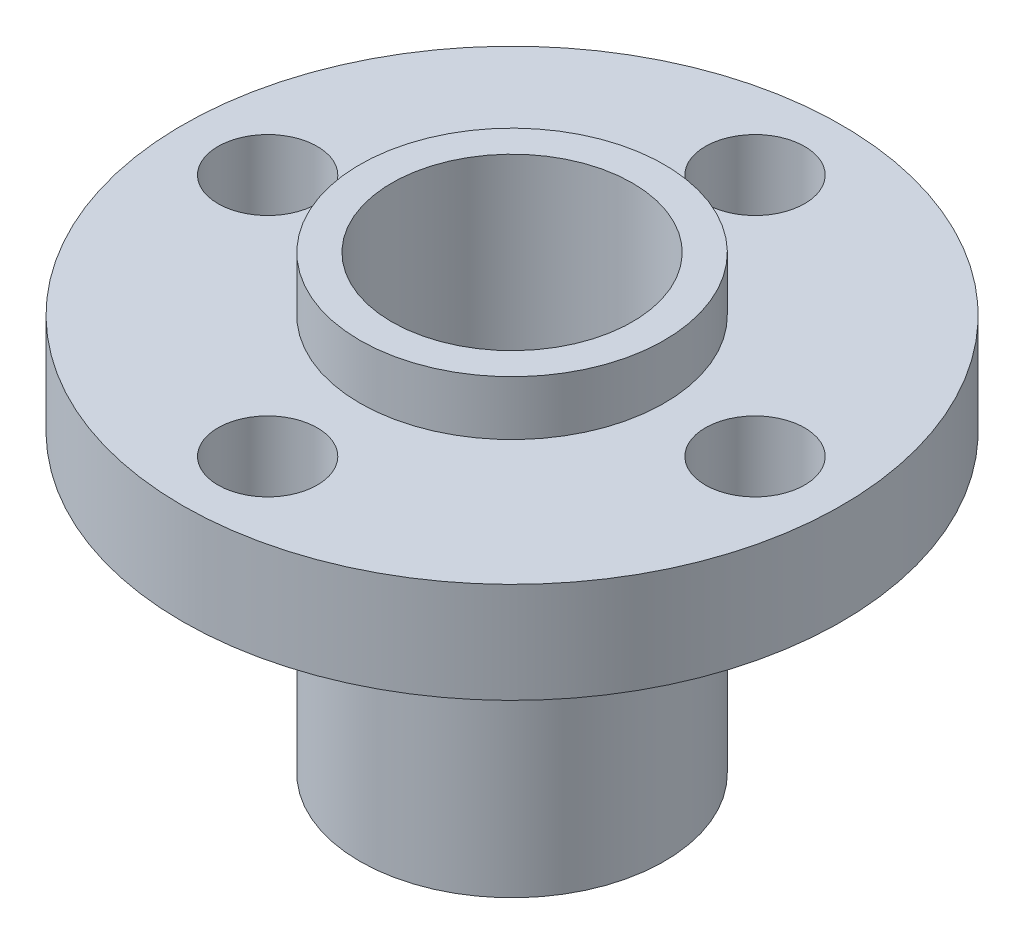
ISO-10303-21;
HEADER;
FILE_DESCRIPTION(('STEP AP214'),'2;1');
FILE_NAME('part.step','',(''),(''),'','','');
FILE_SCHEMA(('AUTOMOTIVE_DESIGN { 1 0 10303 214 1 1 1 1 }'));
ENDSEC;
DATA;
#1=APPLICATION_CONTEXT('core data for automotive mechanical design processes');
#2=APPLICATION_PROTOCOL_DEFINITION('international standard','automotive_design',2000,#1);
#3=PRODUCT_CONTEXT('',#1,'mechanical');
#4=PRODUCT('Part','Part','',(#3));
#5=PRODUCT_RELATED_PRODUCT_CATEGORY('part','',(#4));
#6=PRODUCT_DEFINITION_FORMATION('','',#4);
#7=PRODUCT_DEFINITION_CONTEXT('part definition',#1,'design');
#8=PRODUCT_DEFINITION('design','',#6,#7);
#9=PRODUCT_DEFINITION_SHAPE('','',#8);
#10=(LENGTH_UNIT() NAMED_UNIT(*) SI_UNIT(.MILLI.,.METRE.));
#11=(NAMED_UNIT(*) PLANE_ANGLE_UNIT() SI_UNIT($,.RADIAN.));
#12=(NAMED_UNIT(*) SI_UNIT($,.STERADIAN.) SOLID_ANGLE_UNIT());
#13=UNCERTAINTY_MEASURE_WITH_UNIT(LENGTH_MEASURE(1.E-05),#10,'distance_accuracy_value','');
#14=(GEOMETRIC_REPRESENTATION_CONTEXT(3) GLOBAL_UNCERTAINTY_ASSIGNED_CONTEXT((#13)) GLOBAL_UNIT_ASSIGNED_CONTEXT((#10,
#11,#12)) REPRESENTATION_CONTEXT('',''));
#15=CARTESIAN_POINT('',(0.,0.,0.));
#16=DIRECTION('',(0.,0.,1.));
#17=DIRECTION('',(1.,0.,0.));
#18=AXIS2_PLACEMENT_3D('',#15,#16,#17);
#19=CARTESIAN_POINT('',(0.,15.,0.));
#20=DIRECTION('',(0.,-1.,0.));
#21=DIRECTION('',(0.,0.,-1.));
#22=AXIS2_PLACEMENT_3D('',#19,#20,#21);
#23=CYLINDRICAL_SURFACE('',#22,5.06);
#24=CARTESIAN_POINT('',(0.,0.,0.));
#25=DIRECTION('',(0.,1.,0.));
#26=DIRECTION('',(0.,0.,1.));
#27=AXIS2_PLACEMENT_3D('',#24,#25,#26);
#28=CIRCLE('',#27,5.06);
#29=CARTESIAN_POINT('',(0.,0.,5.06));
#30=VERTEX_POINT('',#29);
#31=EDGE_CURVE('E51',#30,#30,#28,.T.);
#32=ORIENTED_EDGE('',*,*,#31,.T.);
#33=EDGE_LOOP('',(#32));
#34=FACE_BOUND('',#33,.T.);
#35=CARTESIAN_POINT('',(0.,9.85,0.));
#36=DIRECTION('',(0.,1.,0.));
#37=DIRECTION('',(0.,0.,1.));
#38=AXIS2_PLACEMENT_3D('',#35,#36,#37);
#39=CIRCLE('',#38,5.06);
#40=CARTESIAN_POINT('',(0.,9.85,5.06));
#41=VERTEX_POINT('',#40);
#42=EDGE_CURVE('E10',#41,#41,#39,.T.);
#43=ORIENTED_EDGE('',*,*,#42,.F.);
#44=EDGE_LOOP('',(#43));
#45=FACE_BOUND('',#44,.T.);
#46=ADVANCED_FACE('F35',(#34,#45),#23,.T.);
#47=CARTESIAN_POINT('',(0.,15.,0.));
#48=DIRECTION('',(0.,-1.,0.));
#49=DIRECTION('',(0.,0.,-1.));
#50=AXIS2_PLACEMENT_3D('',#47,#48,#49);
#51=CYLINDRICAL_SURFACE('',#50,4.);
#52=CARTESIAN_POINT('',(0.,15.,0.));
#53=DIRECTION('',(0.,1.,0.));
#54=DIRECTION('',(0.,0.,1.));
#55=AXIS2_PLACEMENT_3D('',#52,#53,#54);
#56=CIRCLE('',#55,4.);
#57=CARTESIAN_POINT('',(0.,15.,4.));
#58=VERTEX_POINT('',#57);
#59=EDGE_CURVE('E46',#58,#58,#56,.T.);
#60=ORIENTED_EDGE('',*,*,#59,.T.);
#61=EDGE_LOOP('',(#60));
#62=FACE_BOUND('',#61,.T.);
#63=CARTESIAN_POINT('',(0.,0.,0.));
#64=DIRECTION('',(0.,1.,0.));
#65=DIRECTION('',(0.,0.,1.));
#66=AXIS2_PLACEMENT_3D('',#63,#64,#65);
#67=CIRCLE('',#66,4.);
#68=CARTESIAN_POINT('',(0.,0.,4.));
#69=VERTEX_POINT('',#68);
#70=EDGE_CURVE('E55',#69,#69,#67,.T.);
#71=ORIENTED_EDGE('',*,*,#70,.F.);
#72=EDGE_LOOP('',(#71));
#73=FACE_BOUND('',#72,.T.);
#74=ADVANCED_FACE('F37',(#62,#73),#51,.F.);
#75=CARTESIAN_POINT('',(0.,13.19,0.));
#76=DIRECTION('',(0.,1.,0.));
#77=DIRECTION('',(0.,0.,1.));
#78=AXIS2_PLACEMENT_3D('',#75,#76,#77);
#79=CIRCLE('',#78,5.06);
#80=CARTESIAN_POINT('',(0.,13.19,5.06));
#81=VERTEX_POINT('',#80);
#82=EDGE_CURVE('E91',#81,#81,#79,.T.);
#83=ORIENTED_EDGE('',*,*,#82,.T.);
#84=EDGE_LOOP('',(#83));
#85=FACE_BOUND('',#84,.T.);
#86=CARTESIAN_POINT('',(0.,15.,0.));
#87=DIRECTION('',(0.,1.,0.));
#88=DIRECTION('',(0.,0.,1.));
#89=AXIS2_PLACEMENT_3D('',#86,#87,#88);
#90=CIRCLE('',#89,5.06);
#91=CARTESIAN_POINT('',(0.,15.,5.06));
#92=VERTEX_POINT('',#91);
#93=EDGE_CURVE('E42',#92,#92,#90,.T.);
#94=ORIENTED_EDGE('',*,*,#93,.F.);
#95=EDGE_LOOP('',(#94));
#96=FACE_BOUND('',#95,.T.);
#97=ADVANCED_FACE('F76',(#85,#96),#23,.T.);
#98=CARTESIAN_POINT('',(0.,15.,0.));
#99=DIRECTION('',(0.,1.,0.));
#100=DIRECTION('',(0.,0.,1.));
#101=AXIS2_PLACEMENT_3D('',#98,#99,#100);
#102=PLANE('',#101);
#103=ORIENTED_EDGE('',*,*,#59,.F.);
#104=EDGE_LOOP('',(#103));
#105=FACE_BOUND('',#104,.T.);
#106=ORIENTED_EDGE('',*,*,#93,.T.);
#107=EDGE_LOOP('',(#106));
#108=FACE_BOUND('',#107,.T.);
#109=ADVANCED_FACE('F66',(#105,#108),#102,.T.);
#110=CARTESIAN_POINT('',(0.,0.,0.));
#111=DIRECTION('',(0.,1.,0.));
#112=DIRECTION('',(0.,0.,1.));
#113=AXIS2_PLACEMENT_3D('',#110,#111,#112);
#114=PLANE('',#113);
#115=ORIENTED_EDGE('',*,*,#70,.T.);
#116=EDGE_LOOP('',(#115));
#117=FACE_BOUND('',#116,.T.);
#118=ORIENTED_EDGE('',*,*,#31,.F.);
#119=EDGE_LOOP('',(#118));
#120=FACE_BOUND('',#119,.T.);
#121=ADVANCED_FACE('F63',(#117,#120),#114,.F.);
#122=CARTESIAN_POINT('',(0.,13.19,-8.07531049465373));
#123=DIRECTION('',(0.,-1.,0.));
#124=DIRECTION('',(0.,0.,-1.));
#125=AXIS2_PLACEMENT_3D('',#122,#123,#124);
#126=CYLINDRICAL_SURFACE('',#125,1.65);
#127=CARTESIAN_POINT('',(0.,13.19,-8.07531049465373));
#128=DIRECTION('',(0.,1.,0.));
#129=DIRECTION('',(0.,0.,1.));
#130=AXIS2_PLACEMENT_3D('',#127,#128,#129);
#131=CIRCLE('',#130,1.65);
#132=CARTESIAN_POINT('',(0.,13.19,-6.42531049465373));
#133=VERTEX_POINT('',#132);
#134=EDGE_CURVE('E93',#133,#133,#131,.T.);
#135=ORIENTED_EDGE('',*,*,#134,.T.);
#136=EDGE_LOOP('',(#135));
#137=FACE_BOUND('',#136,.T.);
#138=CARTESIAN_POINT('',(0.,9.85,-8.07531049465373));
#139=DIRECTION('',(0.,1.,0.));
#140=DIRECTION('',(0.,0.,1.));
#141=AXIS2_PLACEMENT_3D('',#138,#139,#140);
#142=CIRCLE('',#141,1.65);
#143=CARTESIAN_POINT('',(0.,9.85,-6.42531049465373));
#144=VERTEX_POINT('',#143);
#145=EDGE_CURVE('E111',#144,#144,#142,.T.);
#146=ORIENTED_EDGE('',*,*,#145,.F.);
#147=EDGE_LOOP('',(#146));
#148=FACE_BOUND('',#147,.T.);
#149=ADVANCED_FACE('F65',(#137,#148),#126,.F.);
#150=CARTESIAN_POINT('',(8.10000000000023,13.19,0.0246895053460434));
#151=DIRECTION('',(0.,-1.,0.));
#152=DIRECTION('',(0.,0.,-1.));
#153=AXIS2_PLACEMENT_3D('',#150,#151,#152);
#154=CYLINDRICAL_SURFACE('',#153,1.65);
#155=CARTESIAN_POINT('',(8.10000000000023,13.19,0.0246895053460434));
#156=DIRECTION('',(0.,1.,0.));
#157=DIRECTION('',(0.,0.,1.));
#158=AXIS2_PLACEMENT_3D('',#155,#156,#157);
#159=CIRCLE('',#158,1.65);
#160=CARTESIAN_POINT('',(8.10000000000023,13.19,1.67468950534604));
#161=VERTEX_POINT('',#160);
#162=EDGE_CURVE('E98',#161,#161,#159,.T.);
#163=ORIENTED_EDGE('',*,*,#162,.T.);
#164=EDGE_LOOP('',(#163));
#165=FACE_BOUND('',#164,.T.);
#166=CARTESIAN_POINT('',(8.10000000000023,9.85,0.0246895053460434));
#167=DIRECTION('',(0.,1.,0.));
#168=DIRECTION('',(0.,0.,1.));
#169=AXIS2_PLACEMENT_3D('',#166,#167,#168);
#170=CIRCLE('',#169,1.65);
#171=CARTESIAN_POINT('',(8.10000000000023,9.85,1.67468950534604));
#172=VERTEX_POINT('',#171);
#173=EDGE_CURVE('E108',#172,#172,#170,.T.);
#174=ORIENTED_EDGE('',*,*,#173,.F.);
#175=EDGE_LOOP('',(#174));
#176=FACE_BOUND('',#175,.T.);
#177=ADVANCED_FACE('F73',(#165,#176),#154,.F.);
#178=CARTESIAN_POINT('',(4.59845153667052E-13,13.19,8.12468950534627));
#179=DIRECTION('',(0.,-1.,0.));
#180=DIRECTION('',(0.,0.,-1.));
#181=AXIS2_PLACEMENT_3D('',#178,#179,#180);
#182=CYLINDRICAL_SURFACE('',#181,1.65000000000049);
#183=CARTESIAN_POINT('',(4.59845153667052E-13,13.19,8.12468950534627));
#184=DIRECTION('',(0.,1.,0.));
#185=DIRECTION('',(0.,0.,1.));
#186=AXIS2_PLACEMENT_3D('',#183,#184,#185);
#187=CIRCLE('',#186,1.65000000000049);
#188=CARTESIAN_POINT('',(4.59845153667052E-13,13.19,9.77468950534677));
#189=VERTEX_POINT('',#188);
#190=EDGE_CURVE('E119',#189,#189,#187,.T.);
#191=ORIENTED_EDGE('',*,*,#190,.T.);
#192=EDGE_LOOP('',(#191));
#193=FACE_BOUND('',#192,.T.);
#194=CARTESIAN_POINT('',(4.59845153667052E-13,9.85,8.12468950534627));
#195=DIRECTION('',(0.,1.,0.));
#196=DIRECTION('',(0.,0.,1.));
#197=AXIS2_PLACEMENT_3D('',#194,#195,#196);
#198=CIRCLE('',#197,1.65000000000049);
#199=CARTESIAN_POINT('',(4.59845153667052E-13,9.85,9.77468950534677));
#200=VERTEX_POINT('',#199);
#201=EDGE_CURVE('E105',#200,#200,#198,.T.);
#202=ORIENTED_EDGE('',*,*,#201,.F.);
#203=EDGE_LOOP('',(#202));
#204=FACE_BOUND('',#203,.T.);
#205=ADVANCED_FACE('F147',(#193,#204),#182,.F.);
#206=CARTESIAN_POINT('',(-8.09999999999977,13.19,0.0246895053465038));
#207=DIRECTION('',(0.,-1.,0.));
#208=DIRECTION('',(0.,0.,-1.));
#209=AXIS2_PLACEMENT_3D('',#206,#207,#208);
#210=CYLINDRICAL_SURFACE('',#209,1.65);
#211=CARTESIAN_POINT('',(-8.09999999999977,13.19,0.0246895053465038));
#212=DIRECTION('',(0.,1.,0.));
#213=DIRECTION('',(0.,0.,1.));
#214=AXIS2_PLACEMENT_3D('',#211,#212,#213);
#215=CIRCLE('',#214,1.65);
#216=CARTESIAN_POINT('',(-8.09999999999977,13.19,1.6746895053465));
#217=VERTEX_POINT('',#216);
#218=EDGE_CURVE('E115',#217,#217,#215,.T.);
#219=ORIENTED_EDGE('',*,*,#218,.T.);
#220=EDGE_LOOP('',(#219));
#221=FACE_BOUND('',#220,.T.);
#222=CARTESIAN_POINT('',(-8.09999999999977,9.85,0.0246895053465038));
#223=DIRECTION('',(0.,1.,0.));
#224=DIRECTION('',(0.,0.,1.));
#225=AXIS2_PLACEMENT_3D('',#222,#223,#224);
#226=CIRCLE('',#225,1.65);
#227=CARTESIAN_POINT('',(-8.09999999999977,9.85,1.6746895053465));
#228=VERTEX_POINT('',#227);
#229=EDGE_CURVE('E102',#228,#228,#226,.T.);
#230=ORIENTED_EDGE('',*,*,#229,.F.);
#231=EDGE_LOOP('',(#230));
#232=FACE_BOUND('',#231,.T.);
#233=ADVANCED_FACE('F142',(#221,#232),#210,.F.);
#234=CARTESIAN_POINT('',(0.,13.19,0.));
#235=DIRECTION('',(0.,-1.,0.));
#236=DIRECTION('',(0.,0.,-1.));
#237=AXIS2_PLACEMENT_3D('',#234,#235,#236);
#238=CYLINDRICAL_SURFACE('',#237,10.955);
#239=CARTESIAN_POINT('',(0.,13.19,0.));
#240=DIRECTION('',(0.,1.,0.));
#241=DIRECTION('',(0.,0.,1.));
#242=AXIS2_PLACEMENT_3D('',#239,#240,#241);
#243=CIRCLE('',#242,10.955);
#244=CARTESIAN_POINT('',(0.,13.19,10.955));
#245=VERTEX_POINT('',#244);
#246=EDGE_CURVE('E57',#245,#245,#243,.T.);
#247=ORIENTED_EDGE('',*,*,#246,.F.);
#248=EDGE_LOOP('',(#247));
#249=FACE_BOUND('',#248,.T.);
#250=CARTESIAN_POINT('',(0.,9.85,0.));
#251=DIRECTION('',(0.,1.,0.));
#252=DIRECTION('',(0.,0.,1.));
#253=AXIS2_PLACEMENT_3D('',#250,#251,#252);
#254=CIRCLE('',#253,10.955);
#255=CARTESIAN_POINT('',(0.,9.85,10.955));
#256=VERTEX_POINT('',#255);
#257=EDGE_CURVE('E113',#256,#256,#254,.T.);
#258=ORIENTED_EDGE('',*,*,#257,.T.);
#259=EDGE_LOOP('',(#258));
#260=FACE_BOUND('',#259,.T.);
#261=ADVANCED_FACE('F134',(#249,#260),#238,.T.);
#262=CARTESIAN_POINT('',(0.,13.19,0.));
#263=DIRECTION('',(0.,1.,0.));
#264=DIRECTION('',(0.,0.,1.));
#265=AXIS2_PLACEMENT_3D('',#262,#263,#264);
#266=PLANE('',#265);
#267=ORIENTED_EDGE('',*,*,#218,.F.);
#268=EDGE_LOOP('',(#267));
#269=FACE_BOUND('',#268,.T.);
#270=ORIENTED_EDGE('',*,*,#190,.F.);
#271=EDGE_LOOP('',(#270));
#272=FACE_BOUND('',#271,.T.);
#273=ORIENTED_EDGE('',*,*,#162,.F.);
#274=EDGE_LOOP('',(#273));
#275=FACE_BOUND('',#274,.T.);
#276=ORIENTED_EDGE('',*,*,#134,.F.);
#277=EDGE_LOOP('',(#276));
#278=FACE_BOUND('',#277,.T.);
#279=ORIENTED_EDGE('',*,*,#82,.F.);
#280=EDGE_LOOP('',(#279));
#281=FACE_BOUND('',#280,.T.);
#282=ORIENTED_EDGE('',*,*,#246,.T.);
#283=EDGE_LOOP('',(#282));
#284=FACE_BOUND('',#283,.T.);
#285=ADVANCED_FACE('F130',(#269,#272,#275,#278,#281,#284),#266,.T.);
#286=CARTESIAN_POINT('',(0.,9.85,0.));
#287=DIRECTION('',(0.,1.,0.));
#288=DIRECTION('',(0.,0.,1.));
#289=AXIS2_PLACEMENT_3D('',#286,#287,#288);
#290=PLANE('',#289);
#291=ORIENTED_EDGE('',*,*,#229,.T.);
#292=EDGE_LOOP('',(#291));
#293=FACE_BOUND('',#292,.T.);
#294=ORIENTED_EDGE('',*,*,#201,.T.);
#295=EDGE_LOOP('',(#294));
#296=FACE_BOUND('',#295,.T.);
#297=ORIENTED_EDGE('',*,*,#173,.T.);
#298=EDGE_LOOP('',(#297));
#299=FACE_BOUND('',#298,.T.);
#300=ORIENTED_EDGE('',*,*,#145,.T.);
#301=EDGE_LOOP('',(#300));
#302=FACE_BOUND('',#301,.T.);
#303=ORIENTED_EDGE('',*,*,#42,.T.);
#304=EDGE_LOOP('',(#303));
#305=FACE_BOUND('',#304,.T.);
#306=ORIENTED_EDGE('',*,*,#257,.F.);
#307=EDGE_LOOP('',(#306));
#308=FACE_BOUND('',#307,.T.);
#309=ADVANCED_FACE('F133',(#293,#296,#299,#302,#305,#308),#290,.F.);
#310=CLOSED_SHELL('',(#46,#74,#97,#109,#121,#149,#177,#205,#233,#261,#285,#309));
#311=MANIFOLD_SOLID_BREP('B2',#310);
#312=ADVANCED_BREP_SHAPE_REPRESENTATION('',(#18,#311),#14);
#313=SHAPE_DEFINITION_REPRESENTATION(#9,#312);
ENDSEC;
END-ISO-10303-21;
